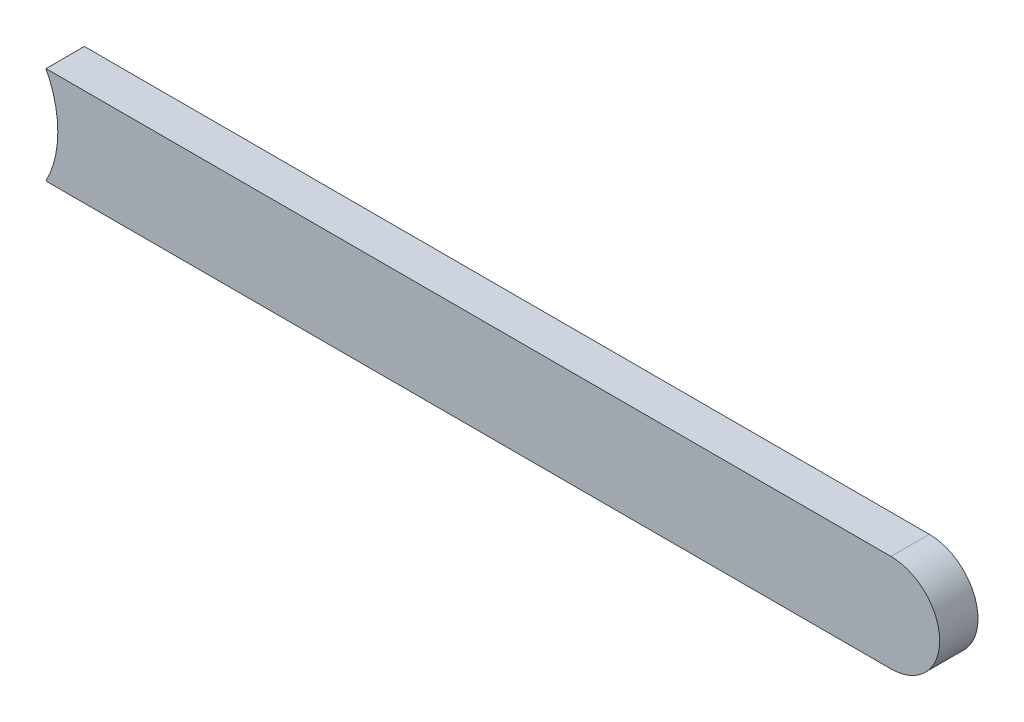
ISO-10303-21;
HEADER;
FILE_DESCRIPTION(('STEP AP214'),'2;1');
FILE_NAME('part.step','',(''),(''),'','','');
FILE_SCHEMA(('AUTOMOTIVE_DESIGN { 1 0 10303 214 1 1 1 1 }'));
ENDSEC;
DATA;
#1=APPLICATION_CONTEXT('core data for automotive mechanical design processes');
#2=APPLICATION_PROTOCOL_DEFINITION('international standard','automotive_design',2000,#1);
#3=PRODUCT_CONTEXT('',#1,'mechanical');
#4=PRODUCT('Part','Part','',(#3));
#5=PRODUCT_RELATED_PRODUCT_CATEGORY('part','',(#4));
#6=PRODUCT_DEFINITION_FORMATION('','',#4);
#7=PRODUCT_DEFINITION_CONTEXT('part definition',#1,'design');
#8=PRODUCT_DEFINITION('design','',#6,#7);
#9=PRODUCT_DEFINITION_SHAPE('','',#8);
#10=(LENGTH_UNIT() NAMED_UNIT(*) SI_UNIT(.MILLI.,.METRE.));
#11=(NAMED_UNIT(*) PLANE_ANGLE_UNIT() SI_UNIT($,.RADIAN.));
#12=(NAMED_UNIT(*) SI_UNIT($,.STERADIAN.) SOLID_ANGLE_UNIT());
#13=UNCERTAINTY_MEASURE_WITH_UNIT(LENGTH_MEASURE(1.E-05),#10,'distance_accuracy_value','');
#14=(GEOMETRIC_REPRESENTATION_CONTEXT(3) GLOBAL_UNCERTAINTY_ASSIGNED_CONTEXT((#13)) GLOBAL_UNIT_ASSIGNED_CONTEXT((#10,
#11,#12)) REPRESENTATION_CONTEXT('',''));
#15=CARTESIAN_POINT('',(0.,0.,0.));
#16=DIRECTION('',(0.,0.,1.));
#17=DIRECTION('',(1.,0.,0.));
#18=AXIS2_PLACEMENT_3D('',#15,#16,#17);
#19=CARTESIAN_POINT('',(134.224466490858,80.5150028,0.));
#20=DIRECTION('',(0.,1.,0.));
#21=DIRECTION('',(1.,0.,0.));
#22=AXIS2_PLACEMENT_3D('',#19,#20,#21);
#23=PLANE('',#22);
#24=DIRECTION('',(1.,0.,0.));
#25=VECTOR('',#24,1.);
#26=CARTESIAN_POINT('',(133.731,80.5150028,0.1999996));
#27=LINE('',#26,#25);
#28=CARTESIAN_POINT('',(134.224466490858,80.5150028,0.1999996));
#29=VERTEX_POINT('',#28);
#30=CARTESIAN_POINT('',(138.6302028,80.5150028,0.1999996));
#31=VERTEX_POINT('',#30);
#32=EDGE_CURVE('E11',#29,#31,#27,.T.);
#33=ORIENTED_EDGE('',*,*,#32,.F.);
#34=DIRECTION('',(0.,0.,1.));
#35=VECTOR('',#34,1.);
#36=CARTESIAN_POINT('',(134.224466490858,80.5150028,0.));
#37=LINE('',#36,#35);
#38=CARTESIAN_POINT('',(134.224466490858,80.5150028,0.));
#39=VERTEX_POINT('',#38);
#40=EDGE_CURVE('E24',#39,#29,#37,.T.);
#41=ORIENTED_EDGE('',*,*,#40,.F.);
#42=DIRECTION('',(1.,0.,0.));
#43=VECTOR('',#42,1.);
#44=CARTESIAN_POINT('',(133.731,80.5150028,0.));
#45=LINE('',#44,#43);
#46=CARTESIAN_POINT('',(138.6302028,80.5150028,0.));
#47=VERTEX_POINT('',#46);
#48=EDGE_CURVE('E82',#39,#47,#45,.T.);
#49=ORIENTED_EDGE('',*,*,#48,.T.);
#50=DIRECTION('',(0.,0.,1.));
#51=VECTOR('',#50,1.);
#52=CARTESIAN_POINT('',(138.6302028,80.5150028,0.));
#53=LINE('',#52,#51);
#54=EDGE_CURVE('E37',#47,#31,#53,.T.);
#55=ORIENTED_EDGE('',*,*,#54,.T.);
#56=EDGE_LOOP('',(#33,#41,#49,#55));
#57=FACE_BOUND('',#56,.T.);
#58=ADVANCED_FACE('F17',(#57),#23,.F.);
#59=CARTESIAN_POINT('',(138.6302028,80.7690028,0.));
#60=DIRECTION('',(0.,0.,-1.));
#61=DIRECTION('',(0.,-1.,0.));
#62=AXIS2_PLACEMENT_3D('',#59,#60,#61);
#63=CYLINDRICAL_SURFACE('',#62,0.253999999999995);
#64=CARTESIAN_POINT('',(138.6302028,80.7690028,0.1999996));
#65=DIRECTION('',(0.,0.,1.));
#66=DIRECTION('',(0.,-1.,0.));
#67=AXIS2_PLACEMENT_3D('',#64,#65,#66);
#68=CIRCLE('',#67,0.253999999999995);
#69=CARTESIAN_POINT('',(138.6302028,81.0230028,0.1999996));
#70=VERTEX_POINT('',#69);
#71=EDGE_CURVE('E97',#31,#70,#68,.T.);
#72=ORIENTED_EDGE('',*,*,#71,.F.);
#73=ORIENTED_EDGE('',*,*,#54,.F.);
#74=CARTESIAN_POINT('',(138.6302028,80.7690028,0.));
#75=DIRECTION('',(0.,0.,1.));
#76=DIRECTION('',(0.,-1.,0.));
#77=AXIS2_PLACEMENT_3D('',#74,#75,#76);
#78=CIRCLE('',#77,0.253999999999995);
#79=CARTESIAN_POINT('',(138.6302028,81.0230028,0.));
#80=VERTEX_POINT('',#79);
#81=EDGE_CURVE('E94',#47,#80,#78,.T.);
#82=ORIENTED_EDGE('',*,*,#81,.T.);
#83=DIRECTION('',(0.,0.,1.));
#84=VECTOR('',#83,1.);
#85=CARTESIAN_POINT('',(138.6302028,81.0230028,0.));
#86=LINE('',#85,#84);
#87=EDGE_CURVE('E92',#80,#70,#86,.T.);
#88=ORIENTED_EDGE('',*,*,#87,.T.);
#89=EDGE_LOOP('',(#72,#73,#82,#88));
#90=FACE_BOUND('',#89,.T.);
#91=ADVANCED_FACE('F103',(#90),#63,.T.);
#92=CARTESIAN_POINT('',(138.6302028,81.0230028,0.));
#93=DIRECTION('',(0.,-1.,0.));
#94=DIRECTION('',(-1.,0.,0.));
#95=AXIS2_PLACEMENT_3D('',#92,#93,#94);
#96=PLANE('',#95);
#97=DIRECTION('',(-1.,0.,0.));
#98=VECTOR('',#97,1.);
#99=CARTESIAN_POINT('',(138.6302028,81.0230028,0.1999996));
#100=LINE('',#99,#98);
#101=CARTESIAN_POINT('',(134.224466490858,81.0230028,0.1999996));
#102=VERTEX_POINT('',#101);
#103=EDGE_CURVE('E89',#70,#102,#100,.T.);
#104=ORIENTED_EDGE('',*,*,#103,.F.);
#105=ORIENTED_EDGE('',*,*,#87,.F.);
#106=DIRECTION('',(-1.,0.,0.));
#107=VECTOR('',#106,1.);
#108=CARTESIAN_POINT('',(138.6302028,81.0230028,0.));
#109=LINE('',#108,#107);
#110=CARTESIAN_POINT('',(134.224466490858,81.0230028,0.));
#111=VERTEX_POINT('',#110);
#112=EDGE_CURVE('E87',#80,#111,#109,.T.);
#113=ORIENTED_EDGE('',*,*,#112,.T.);
#114=DIRECTION('',(0.,0.,1.));
#115=VECTOR('',#114,1.);
#116=CARTESIAN_POINT('',(134.224466490858,81.0230028,0.));
#117=LINE('',#116,#115);
#118=EDGE_CURVE('E69',#111,#102,#117,.T.);
#119=ORIENTED_EDGE('',*,*,#118,.T.);
#120=EDGE_LOOP('',(#104,#105,#113,#119));
#121=FACE_BOUND('',#120,.T.);
#122=ADVANCED_FACE('F108',(#121),#96,.F.);
#123=CARTESIAN_POINT('',(133.731,80.7690028,0.));
#124=DIRECTION('',(0.,0.,-1.));
#125=DIRECTION('',(1.,0.,0.));
#126=AXIS2_PLACEMENT_3D('',#123,#124,#125);
#127=CYLINDRICAL_SURFACE('',#126,0.55500016);
#128=DIRECTION('',(0.,0.,1.));
#129=VECTOR('',#128,1.);
#130=CARTESIAN_POINT('',(134.28600016,80.7690028,0.));
#131=LINE('',#130,#129);
#132=CARTESIAN_POINT('',(134.28600016,80.7690028,0.));
#133=VERTEX_POINT('',#132);
#134=CARTESIAN_POINT('',(134.28600016,80.7690028,0.1999996));
#135=VERTEX_POINT('',#134);
#136=EDGE_CURVE('E59',#133,#135,#131,.T.);
#137=ORIENTED_EDGE('',*,*,#136,.T.);
#138=CARTESIAN_POINT('',(133.731,80.7690028,0.1999996));
#139=DIRECTION('',(0.,0.,1.));
#140=DIRECTION('',(1.,0.,0.));
#141=AXIS2_PLACEMENT_3D('',#138,#139,#140);
#142=CIRCLE('',#141,0.55500016);
#143=EDGE_CURVE('E70',#135,#102,#142,.T.);
#144=ORIENTED_EDGE('',*,*,#143,.T.);
#145=ORIENTED_EDGE('',*,*,#118,.F.);
#146=CARTESIAN_POINT('',(133.731,80.7690028,0.));
#147=DIRECTION('',(0.,0.,1.));
#148=DIRECTION('',(1.,0.,0.));
#149=AXIS2_PLACEMENT_3D('',#146,#147,#148);
#150=CIRCLE('',#149,0.55500016);
#151=EDGE_CURVE('E73',#133,#111,#150,.T.);
#152=ORIENTED_EDGE('',*,*,#151,.F.);
#153=EDGE_LOOP('',(#137,#144,#145,#152));
#154=FACE_BOUND('',#153,.T.);
#155=ADVANCED_FACE('F74',(#154),#127,.F.);
#156=CARTESIAN_POINT('',(133.731,80.7690028,0.));
#157=DIRECTION('',(0.,0.,-1.));
#158=DIRECTION('',(1.,0.,0.));
#159=AXIS2_PLACEMENT_3D('',#156,#157,#158);
#160=CYLINDRICAL_SURFACE('',#159,0.55500016);
#161=ORIENTED_EDGE('',*,*,#40,.T.);
#162=CARTESIAN_POINT('',(133.731,80.7690028,0.1999996));
#163=DIRECTION('',(0.,0.,1.));
#164=DIRECTION('',(1.,0.,0.));
#165=AXIS2_PLACEMENT_3D('',#162,#163,#164);
#166=CIRCLE('',#165,0.55500016);
#167=EDGE_CURVE('E65',#29,#135,#166,.T.);
#168=ORIENTED_EDGE('',*,*,#167,.T.);
#169=ORIENTED_EDGE('',*,*,#136,.F.);
#170=EDGE_CURVE('E63',#39,#133,#150,.T.);
#171=ORIENTED_EDGE('',*,*,#170,.F.);
#172=EDGE_LOOP('',(#161,#168,#169,#171));
#173=FACE_BOUND('',#172,.T.);
#174=ADVANCED_FACE('F61',(#173),#160,.F.);
#175=CARTESIAN_POINT('',(133.731,80.5150028,0.));
#176=DIRECTION('',(0.,0.,-1.));
#177=DIRECTION('',(-1.,0.,0.));
#178=AXIS2_PLACEMENT_3D('',#175,#176,#177);
#179=PLANE('',#178);
#180=ORIENTED_EDGE('',*,*,#48,.F.);
#181=ORIENTED_EDGE('',*,*,#170,.T.);
#182=ORIENTED_EDGE('',*,*,#151,.T.);
#183=ORIENTED_EDGE('',*,*,#112,.F.);
#184=ORIENTED_EDGE('',*,*,#81,.F.);
#185=EDGE_LOOP('',(#180,#181,#182,#183,#184));
#186=FACE_BOUND('',#185,.T.);
#187=ADVANCED_FACE('F80',(#186),#179,.T.);
#188=CARTESIAN_POINT('',(133.731,80.5150028,0.1999996));
#189=DIRECTION('',(0.,0.,-1.));
#190=DIRECTION('',(-1.,0.,0.));
#191=AXIS2_PLACEMENT_3D('',#188,#189,#190);
#192=PLANE('',#191);
#193=ORIENTED_EDGE('',*,*,#167,.F.);
#194=ORIENTED_EDGE('',*,*,#32,.T.);
#195=ORIENTED_EDGE('',*,*,#71,.T.);
#196=ORIENTED_EDGE('',*,*,#103,.T.);
#197=ORIENTED_EDGE('',*,*,#143,.F.);
#198=EDGE_LOOP('',(#193,#194,#195,#196,#197));
#199=FACE_BOUND('',#198,.T.);
#200=ADVANCED_FACE('F106',(#199),#192,.F.);
#201=CLOSED_SHELL('',(#58,#91,#122,#155,#174,#187,#200));
#202=MANIFOLD_SOLID_BREP('B1',#201);
#203=ADVANCED_BREP_SHAPE_REPRESENTATION('',(#18,#202),#14);
#204=SHAPE_DEFINITION_REPRESENTATION(#9,#203);
ENDSEC;
END-ISO-10303-21;
